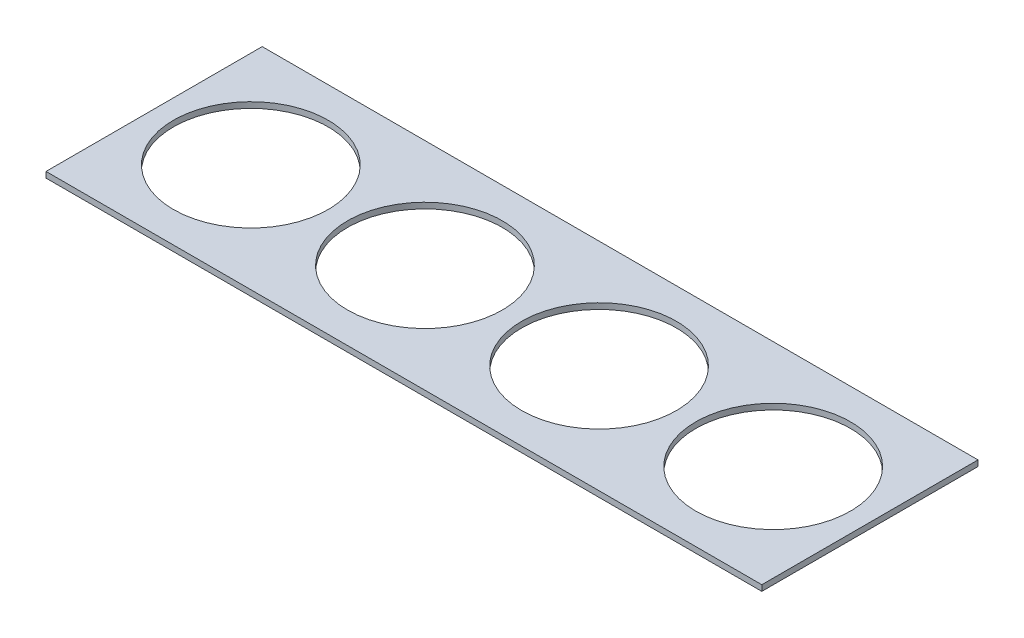
ISO-10303-21;
HEADER;
FILE_DESCRIPTION(('STEP AP214'),'2;1');
FILE_NAME('part.step','',(''),(''),'','','');
FILE_SCHEMA(('AUTOMOTIVE_DESIGN { 1 0 10303 214 1 1 1 1 }'));
ENDSEC;
DATA;
#1=APPLICATION_CONTEXT('core data for automotive mechanical design processes');
#2=APPLICATION_PROTOCOL_DEFINITION('international standard','automotive_design',2000,#1);
#3=PRODUCT_CONTEXT('',#1,'mechanical');
#4=PRODUCT('Part','Part','',(#3));
#5=PRODUCT_RELATED_PRODUCT_CATEGORY('part','',(#4));
#6=PRODUCT_DEFINITION_FORMATION('','',#4);
#7=PRODUCT_DEFINITION_CONTEXT('part definition',#1,'design');
#8=PRODUCT_DEFINITION('design','',#6,#7);
#9=PRODUCT_DEFINITION_SHAPE('','',#8);
#10=(LENGTH_UNIT() NAMED_UNIT(*) SI_UNIT(.MILLI.,.METRE.));
#11=(NAMED_UNIT(*) PLANE_ANGLE_UNIT() SI_UNIT($,.RADIAN.));
#12=(NAMED_UNIT(*) SI_UNIT($,.STERADIAN.) SOLID_ANGLE_UNIT());
#13=UNCERTAINTY_MEASURE_WITH_UNIT(LENGTH_MEASURE(1.E-05),#10,'distance_accuracy_value','');
#14=(GEOMETRIC_REPRESENTATION_CONTEXT(3) GLOBAL_UNCERTAINTY_ASSIGNED_CONTEXT((#13)) GLOBAL_UNIT_ASSIGNED_CONTEXT((#10,
#11,#12)) REPRESENTATION_CONTEXT('',''));
#15=CARTESIAN_POINT('',(0.,0.,0.));
#16=DIRECTION('',(0.,0.,1.));
#17=DIRECTION('',(1.,0.,0.));
#18=AXIS2_PLACEMENT_3D('',#15,#16,#17);
#19=CARTESIAN_POINT('',(0.,3.,0.));
#20=DIRECTION('',(0.,-1.,0.));
#21=DIRECTION('',(0.,0.,-1.));
#22=AXIS2_PLACEMENT_3D('',#19,#20,#21);
#23=PLANE('',#22);
#24=DIRECTION('',(0.,0.,1.));
#25=VECTOR('',#24,1.);
#26=CARTESIAN_POINT('',(-288.537869001243,3.,-64.9351563602903));
#27=LINE('',#26,#25);
#28=CARTESIAN_POINT('',(-288.537869001243,3.,-64.9351563602903));
#29=VERTEX_POINT('',#28);
#30=CARTESIAN_POINT('',(-288.537869001243,3.,46.8148436397097));
#31=VERTEX_POINT('',#30);
#32=EDGE_CURVE('E92',#29,#31,#27,.T.);
#33=ORIENTED_EDGE('',*,*,#32,.T.);
#34=DIRECTION('',(1.,0.,0.));
#35=VECTOR('',#34,1.);
#36=CARTESIAN_POINT('',(81.4621309987569,3.,46.8148436397097));
#37=LINE('',#36,#35);
#38=CARTESIAN_POINT('',(81.4621309987569,3.,46.8148436397097));
#39=VERTEX_POINT('',#38);
#40=EDGE_CURVE('E87',#31,#39,#37,.T.);
#41=ORIENTED_EDGE('',*,*,#40,.T.);
#42=DIRECTION('',(0.,0.,-1.));
#43=VECTOR('',#42,1.);
#44=CARTESIAN_POINT('',(81.4621309987569,3.,-64.9351563602903));
#45=LINE('',#44,#43);
#46=CARTESIAN_POINT('',(81.4621309987569,3.,-64.9351563602903));
#47=VERTEX_POINT('',#46);
#48=EDGE_CURVE('E90',#39,#47,#45,.T.);
#49=ORIENTED_EDGE('',*,*,#48,.T.);
#50=DIRECTION('',(-1.,0.,0.));
#51=VECTOR('',#50,1.);
#52=CARTESIAN_POINT('',(81.4621309987569,3.,-64.9351563602903));
#53=LINE('',#52,#51);
#54=EDGE_CURVE('E57',#47,#29,#53,.T.);
#55=ORIENTED_EDGE('',*,*,#54,.T.);
#56=EDGE_LOOP('',(#33,#41,#49,#55));
#57=FACE_BOUND('',#56,.T.);
#58=CARTESIAN_POINT('',(-238.537869001243,3.,-9.0601563602903));
#59=DIRECTION('',(0.,1.,0.));
#60=DIRECTION('',(0.,0.,1.));
#61=AXIS2_PLACEMENT_3D('',#58,#59,#60);
#62=CIRCLE('',#61,40.);
#63=CARTESIAN_POINT('',(-238.537869001243,3.,30.9398436397097));
#64=VERTEX_POINT('',#63);
#65=EDGE_CURVE('E112',#64,#64,#62,.T.);
#66=ORIENTED_EDGE('',*,*,#65,.F.);
#67=EDGE_LOOP('',(#66));
#68=FACE_BOUND('',#67,.T.);
#69=CARTESIAN_POINT('',(-148.537869001243,3.,-9.0601563602903));
#70=DIRECTION('',(0.,1.,0.));
#71=DIRECTION('',(0.,0.,1.));
#72=AXIS2_PLACEMENT_3D('',#69,#70,#71);
#73=CIRCLE('',#72,40.);
#74=CARTESIAN_POINT('',(-148.537869001243,3.,30.9398436397097));
#75=VERTEX_POINT('',#74);
#76=EDGE_CURVE('E134',#75,#75,#73,.T.);
#77=ORIENTED_EDGE('',*,*,#76,.F.);
#78=EDGE_LOOP('',(#77));
#79=FACE_BOUND('',#78,.T.);
#80=CARTESIAN_POINT('',(-58.5378690012431,3.,-9.0601563602903));
#81=DIRECTION('',(0.,1.,0.));
#82=DIRECTION('',(0.,0.,1.));
#83=AXIS2_PLACEMENT_3D('',#80,#81,#82);
#84=CIRCLE('',#83,40.);
#85=CARTESIAN_POINT('',(-58.5378690012431,3.,30.9398436397097));
#86=VERTEX_POINT('',#85);
#87=EDGE_CURVE('E142',#86,#86,#84,.T.);
#88=ORIENTED_EDGE('',*,*,#87,.F.);
#89=EDGE_LOOP('',(#88));
#90=FACE_BOUND('',#89,.T.);
#91=CARTESIAN_POINT('',(31.4621309987569,3.,-9.0601563602903));
#92=DIRECTION('',(0.,1.,0.));
#93=DIRECTION('',(0.,0.,1.));
#94=AXIS2_PLACEMENT_3D('',#91,#92,#93);
#95=CIRCLE('',#94,40.);
#96=CARTESIAN_POINT('',(31.4621309987569,3.,30.9398436397097));
#97=VERTEX_POINT('',#96);
#98=EDGE_CURVE('E150',#97,#97,#95,.T.);
#99=ORIENTED_EDGE('',*,*,#98,.F.);
#100=EDGE_LOOP('',(#99));
#101=FACE_BOUND('',#100,.T.);
#102=ADVANCED_FACE('F39',(#57,#68,#79,#90,#101),#23,.F.);
#103=CARTESIAN_POINT('',(0.,0.,0.));
#104=DIRECTION('',(0.,-1.,0.));
#105=DIRECTION('',(0.,0.,-1.));
#106=AXIS2_PLACEMENT_3D('',#103,#104,#105);
#107=PLANE('',#106);
#108=CARTESIAN_POINT('',(-58.5378690012431,0.,-9.0601563602903));
#109=DIRECTION('',(0.,1.,0.));
#110=DIRECTION('',(0.,0.,1.));
#111=AXIS2_PLACEMENT_3D('',#108,#109,#110);
#112=CIRCLE('',#111,40.);
#113=CARTESIAN_POINT('',(-58.5378690012431,0.,30.9398436397097));
#114=VERTEX_POINT('',#113);
#115=EDGE_CURVE('E146',#114,#114,#112,.T.);
#116=ORIENTED_EDGE('',*,*,#115,.T.);
#117=EDGE_LOOP('',(#116));
#118=FACE_BOUND('',#117,.T.);
#119=CARTESIAN_POINT('',(-238.537869001243,0.,-9.0601563602903));
#120=DIRECTION('',(0.,1.,0.));
#121=DIRECTION('',(0.,0.,1.));
#122=AXIS2_PLACEMENT_3D('',#119,#120,#121);
#123=CIRCLE('',#122,40.);
#124=CARTESIAN_POINT('',(-238.537869001243,0.,30.9398436397097));
#125=VERTEX_POINT('',#124);
#126=EDGE_CURVE('E130',#125,#125,#123,.T.);
#127=ORIENTED_EDGE('',*,*,#126,.T.);
#128=EDGE_LOOP('',(#127));
#129=FACE_BOUND('',#128,.T.);
#130=DIRECTION('',(0.,0.,1.));
#131=VECTOR('',#130,1.);
#132=CARTESIAN_POINT('',(-288.537869001243,0.,-64.9351563602903));
#133=LINE('',#132,#131);
#134=CARTESIAN_POINT('',(-288.537869001243,0.,-64.9351563602903));
#135=VERTEX_POINT('',#134);
#136=CARTESIAN_POINT('',(-288.537869001243,0.,46.8148436397097));
#137=VERTEX_POINT('',#136);
#138=EDGE_CURVE('E108',#135,#137,#133,.T.);
#139=ORIENTED_EDGE('',*,*,#138,.F.);
#140=DIRECTION('',(-1.,0.,0.));
#141=VECTOR('',#140,1.);
#142=CARTESIAN_POINT('',(81.4621309987569,0.,-64.9351563602903));
#143=LINE('',#142,#141);
#144=CARTESIAN_POINT('',(81.4621309987569,0.,-64.9351563602903));
#145=VERTEX_POINT('',#144);
#146=EDGE_CURVE('E80',#145,#135,#143,.T.);
#147=ORIENTED_EDGE('',*,*,#146,.F.);
#148=DIRECTION('',(0.,0.,-1.));
#149=VECTOR('',#148,1.);
#150=CARTESIAN_POINT('',(81.4621309987569,0.,-64.9351563602903));
#151=LINE('',#150,#149);
#152=CARTESIAN_POINT('',(81.4621309987569,0.,46.8148436397097));
#153=VERTEX_POINT('',#152);
#154=EDGE_CURVE('E74',#153,#145,#151,.T.);
#155=ORIENTED_EDGE('',*,*,#154,.F.);
#156=DIRECTION('',(1.,0.,0.));
#157=VECTOR('',#156,1.);
#158=CARTESIAN_POINT('',(81.4621309987569,0.,46.8148436397097));
#159=LINE('',#158,#157);
#160=EDGE_CURVE('E97',#137,#153,#159,.T.);
#161=ORIENTED_EDGE('',*,*,#160,.F.);
#162=EDGE_LOOP('',(#139,#147,#155,#161));
#163=FACE_BOUND('',#162,.T.);
#164=CARTESIAN_POINT('',(-148.537869001243,0.,-9.0601563602903));
#165=DIRECTION('',(0.,1.,0.));
#166=DIRECTION('',(0.,0.,1.));
#167=AXIS2_PLACEMENT_3D('',#164,#165,#166);
#168=CIRCLE('',#167,40.);
#169=CARTESIAN_POINT('',(-148.537869001243,0.,30.9398436397097));
#170=VERTEX_POINT('',#169);
#171=EDGE_CURVE('E138',#170,#170,#168,.T.);
#172=ORIENTED_EDGE('',*,*,#171,.T.);
#173=EDGE_LOOP('',(#172));
#174=FACE_BOUND('',#173,.T.);
#175=CARTESIAN_POINT('',(31.4621309987569,0.,-9.0601563602903));
#176=DIRECTION('',(0.,1.,0.));
#177=DIRECTION('',(0.,0.,1.));
#178=AXIS2_PLACEMENT_3D('',#175,#176,#177);
#179=CIRCLE('',#178,40.);
#180=CARTESIAN_POINT('',(31.4621309987569,0.,30.9398436397097));
#181=VERTEX_POINT('',#180);
#182=EDGE_CURVE('E154',#181,#181,#179,.T.);
#183=ORIENTED_EDGE('',*,*,#182,.T.);
#184=EDGE_LOOP('',(#183));
#185=FACE_BOUND('',#184,.T.);
#186=ADVANCED_FACE('F125',(#118,#129,#163,#174,#185),#107,.T.);
#187=CARTESIAN_POINT('',(-288.537869001243,3.,-64.9351563602903));
#188=DIRECTION('',(1.,0.,0.));
#189=DIRECTION('',(0.,0.,-1.));
#190=AXIS2_PLACEMENT_3D('',#187,#188,#189);
#191=PLANE('',#190);
#192=ORIENTED_EDGE('',*,*,#138,.T.);
#193=DIRECTION('',(0.,-1.,0.));
#194=VECTOR('',#193,1.);
#195=CARTESIAN_POINT('',(-288.537869001243,3.,46.8148436397097));
#196=LINE('',#195,#194);
#197=EDGE_CURVE('E11',#31,#137,#196,.T.);
#198=ORIENTED_EDGE('',*,*,#197,.F.);
#199=ORIENTED_EDGE('',*,*,#32,.F.);
#200=DIRECTION('',(0.,-1.,0.));
#201=VECTOR('',#200,1.);
#202=CARTESIAN_POINT('',(-288.537869001243,3.,-64.9351563602903));
#203=LINE('',#202,#201);
#204=EDGE_CURVE('E104',#29,#135,#203,.T.);
#205=ORIENTED_EDGE('',*,*,#204,.T.);
#206=EDGE_LOOP('',(#192,#198,#199,#205));
#207=FACE_BOUND('',#206,.T.);
#208=ADVANCED_FACE('F41',(#207),#191,.F.);
#209=CARTESIAN_POINT('',(81.4621309987569,3.,46.8148436397097));
#210=DIRECTION('',(0.,0.,-1.));
#211=DIRECTION('',(-1.,0.,0.));
#212=AXIS2_PLACEMENT_3D('',#209,#210,#211);
#213=PLANE('',#212);
#214=ORIENTED_EDGE('',*,*,#160,.T.);
#215=DIRECTION('',(0.,-1.,0.));
#216=VECTOR('',#215,1.);
#217=CARTESIAN_POINT('',(81.4621309987569,3.,46.8148436397097));
#218=LINE('',#217,#216);
#219=EDGE_CURVE('E49',#39,#153,#218,.T.);
#220=ORIENTED_EDGE('',*,*,#219,.F.);
#221=ORIENTED_EDGE('',*,*,#40,.F.);
#222=ORIENTED_EDGE('',*,*,#197,.T.);
#223=EDGE_LOOP('',(#214,#220,#221,#222));
#224=FACE_BOUND('',#223,.T.);
#225=ADVANCED_FACE('F96',(#224),#213,.F.);
#226=CARTESIAN_POINT('',(81.4621309987569,3.,-64.9351563602903));
#227=DIRECTION('',(-1.,0.,0.));
#228=DIRECTION('',(0.,0.,1.));
#229=AXIS2_PLACEMENT_3D('',#226,#227,#228);
#230=PLANE('',#229);
#231=ORIENTED_EDGE('',*,*,#154,.T.);
#232=DIRECTION('',(0.,-1.,0.));
#233=VECTOR('',#232,1.);
#234=CARTESIAN_POINT('',(81.4621309987569,3.,-64.9351563602903));
#235=LINE('',#234,#233);
#236=EDGE_CURVE('E99',#47,#145,#235,.T.);
#237=ORIENTED_EDGE('',*,*,#236,.F.);
#238=ORIENTED_EDGE('',*,*,#48,.F.);
#239=ORIENTED_EDGE('',*,*,#219,.T.);
#240=EDGE_LOOP('',(#231,#237,#238,#239));
#241=FACE_BOUND('',#240,.T.);
#242=ADVANCED_FACE('F100',(#241),#230,.F.);
#243=CARTESIAN_POINT('',(81.4621309987569,3.,-64.9351563602903));
#244=DIRECTION('',(0.,0.,1.));
#245=DIRECTION('',(1.,0.,0.));
#246=AXIS2_PLACEMENT_3D('',#243,#244,#245);
#247=PLANE('',#246);
#248=ORIENTED_EDGE('',*,*,#146,.T.);
#249=ORIENTED_EDGE('',*,*,#204,.F.);
#250=ORIENTED_EDGE('',*,*,#54,.F.);
#251=ORIENTED_EDGE('',*,*,#236,.T.);
#252=EDGE_LOOP('',(#248,#249,#250,#251));
#253=FACE_BOUND('',#252,.T.);
#254=ADVANCED_FACE('F122',(#253),#247,.F.);
#255=CARTESIAN_POINT('',(-238.537869001243,3.,-9.0601563602903));
#256=DIRECTION('',(0.,-1.,0.));
#257=DIRECTION('',(0.,0.,-1.));
#258=AXIS2_PLACEMENT_3D('',#255,#256,#257);
#259=CYLINDRICAL_SURFACE('',#258,40.);
#260=ORIENTED_EDGE('',*,*,#65,.T.);
#261=EDGE_LOOP('',(#260));
#262=FACE_BOUND('',#261,.T.);
#263=ORIENTED_EDGE('',*,*,#126,.F.);
#264=EDGE_LOOP('',(#263));
#265=FACE_BOUND('',#264,.T.);
#266=ADVANCED_FACE('F173',(#262,#265),#259,.F.);
#267=CARTESIAN_POINT('',(-148.537869001243,3.,-9.0601563602903));
#268=DIRECTION('',(0.,-1.,0.));
#269=DIRECTION('',(0.,0.,-1.));
#270=AXIS2_PLACEMENT_3D('',#267,#268,#269);
#271=CYLINDRICAL_SURFACE('',#270,40.);
#272=ORIENTED_EDGE('',*,*,#76,.T.);
#273=EDGE_LOOP('',(#272));
#274=FACE_BOUND('',#273,.T.);
#275=ORIENTED_EDGE('',*,*,#171,.F.);
#276=EDGE_LOOP('',(#275));
#277=FACE_BOUND('',#276,.T.);
#278=ADVANCED_FACE('F219',(#274,#277),#271,.F.);
#279=CARTESIAN_POINT('',(-58.5378690012431,3.,-9.0601563602903));
#280=DIRECTION('',(0.,-1.,0.));
#281=DIRECTION('',(0.,0.,-1.));
#282=AXIS2_PLACEMENT_3D('',#279,#280,#281);
#283=CYLINDRICAL_SURFACE('',#282,40.);
#284=ORIENTED_EDGE('',*,*,#87,.T.);
#285=EDGE_LOOP('',(#284));
#286=FACE_BOUND('',#285,.T.);
#287=ORIENTED_EDGE('',*,*,#115,.F.);
#288=EDGE_LOOP('',(#287));
#289=FACE_BOUND('',#288,.T.);
#290=ADVANCED_FACE('F227',(#286,#289),#283,.F.);
#291=CARTESIAN_POINT('',(31.4621309987569,3.,-9.0601563602903));
#292=DIRECTION('',(0.,-1.,0.));
#293=DIRECTION('',(0.,0.,-1.));
#294=AXIS2_PLACEMENT_3D('',#291,#292,#293);
#295=CYLINDRICAL_SURFACE('',#294,40.);
#296=ORIENTED_EDGE('',*,*,#98,.T.);
#297=EDGE_LOOP('',(#296));
#298=FACE_BOUND('',#297,.T.);
#299=ORIENTED_EDGE('',*,*,#182,.F.);
#300=EDGE_LOOP('',(#299));
#301=FACE_BOUND('',#300,.T.);
#302=ADVANCED_FACE('F162',(#298,#301),#295,.F.);
#303=CLOSED_SHELL('',(#102,#186,#208,#225,#242,#254,#266,#278,#290,#302));
#304=MANIFOLD_SOLID_BREP('B2',#303);
#305=ADVANCED_BREP_SHAPE_REPRESENTATION('',(#18,#304),#14);
#306=SHAPE_DEFINITION_REPRESENTATION(#9,#305);
ENDSEC;
END-ISO-10303-21;
